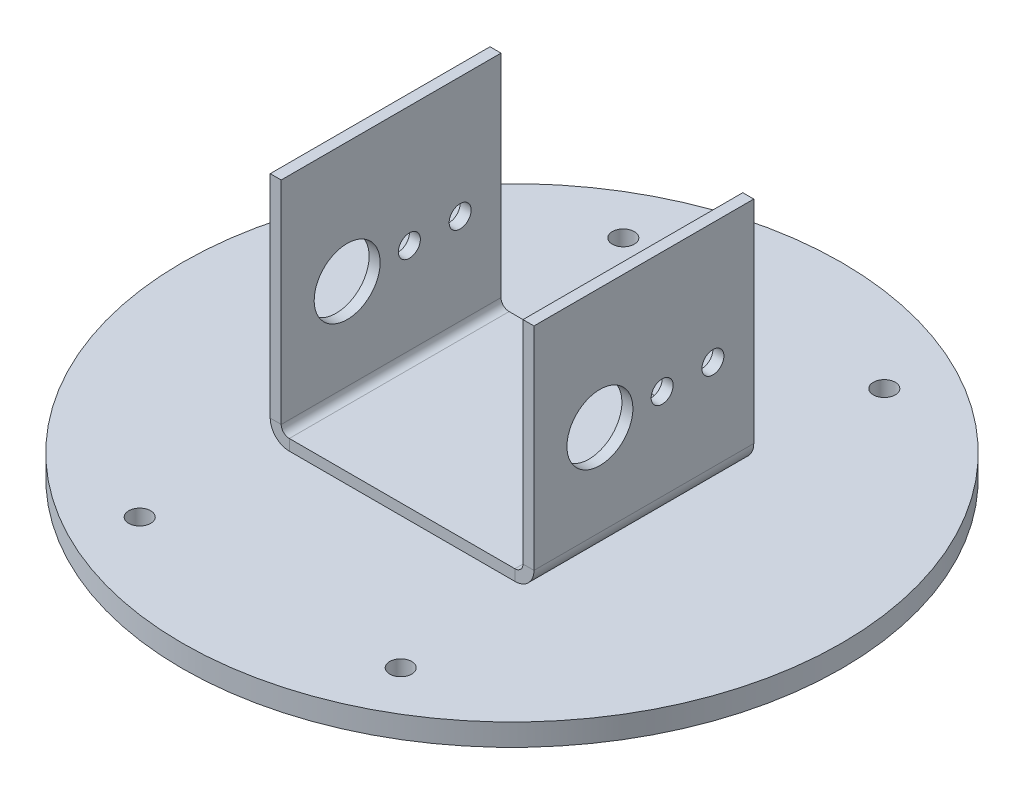
ISO-10303-21;
HEADER;
FILE_DESCRIPTION(('STEP AP214'),'2;1');
FILE_NAME('part.step','',(''),(''),'','','');
FILE_SCHEMA(('AUTOMOTIVE_DESIGN { 1 0 10303 214 1 1 1 1 }'));
ENDSEC;
DATA;
#1=APPLICATION_CONTEXT('core data for automotive mechanical design processes');
#2=APPLICATION_PROTOCOL_DEFINITION('international standard','automotive_design',2000,#1);
#3=PRODUCT_CONTEXT('',#1,'mechanical');
#4=PRODUCT('Part','Part','',(#3));
#5=PRODUCT_RELATED_PRODUCT_CATEGORY('part','',(#4));
#6=PRODUCT_DEFINITION_FORMATION('','',#4);
#7=PRODUCT_DEFINITION_CONTEXT('part definition',#1,'design');
#8=PRODUCT_DEFINITION('design','',#6,#7);
#9=PRODUCT_DEFINITION_SHAPE('','',#8);
#10=(LENGTH_UNIT() NAMED_UNIT(*) SI_UNIT(.MILLI.,.METRE.));
#11=(NAMED_UNIT(*) PLANE_ANGLE_UNIT() SI_UNIT($,.RADIAN.));
#12=(NAMED_UNIT(*) SI_UNIT($,.STERADIAN.) SOLID_ANGLE_UNIT());
#13=UNCERTAINTY_MEASURE_WITH_UNIT(LENGTH_MEASURE(1.E-05),#10,'distance_accuracy_value','');
#14=(GEOMETRIC_REPRESENTATION_CONTEXT(3) GLOBAL_UNCERTAINTY_ASSIGNED_CONTEXT((#13)) GLOBAL_UNIT_ASSIGNED_CONTEXT((#10,
#11,#12)) REPRESENTATION_CONTEXT('',''));
#15=CARTESIAN_POINT('',(0.,0.,0.));
#16=DIRECTION('',(0.,0.,1.));
#17=DIRECTION('',(1.,0.,0.));
#18=AXIS2_PLACEMENT_3D('',#15,#16,#17);
#19=CARTESIAN_POINT('',(-11.,3.,-10.));
#20=DIRECTION('',(0.,0.,1.));
#21=DIRECTION('',(1.,0.,0.));
#22=AXIS2_PLACEMENT_3D('',#19,#20,#21);
#23=PLANE('',#22);
#24=DIRECTION('',(0.,-1.,0.));
#25=VECTOR('',#24,1.);
#26=CARTESIAN_POINT('',(10.2634,3.,-10.));
#27=LINE('',#26,#25);
#28=CARTESIAN_POINT('',(10.2634,3.,-10.));
#29=VERTEX_POINT('',#28);
#30=CARTESIAN_POINT('',(10.2634,2.,-10.));
#31=VERTEX_POINT('',#30);
#32=EDGE_CURVE('E191',#29,#31,#27,.T.);
#33=ORIENTED_EDGE('',*,*,#32,.T.);
#34=DIRECTION('',(-1.,0.,0.));
#35=VECTOR('',#34,1.);
#36=CARTESIAN_POINT('',(-11.,2.,-10.));
#37=LINE('',#36,#35);
#38=CARTESIAN_POINT('',(-10.2634,2.,-10.));
#39=VERTEX_POINT('',#38);
#40=EDGE_CURVE('E251',#31,#39,#37,.T.);
#41=ORIENTED_EDGE('',*,*,#40,.T.);
#42=DIRECTION('',(0.,-1.,0.));
#43=VECTOR('',#42,1.);
#44=CARTESIAN_POINT('',(-10.2634,3.,-10.));
#45=LINE('',#44,#43);
#46=CARTESIAN_POINT('',(-10.2634,3.,-10.));
#47=VERTEX_POINT('',#46);
#48=EDGE_CURVE('E248',#47,#39,#45,.T.);
#49=ORIENTED_EDGE('',*,*,#48,.F.);
#50=DIRECTION('',(-1.,0.,0.));
#51=VECTOR('',#50,1.);
#52=CARTESIAN_POINT('',(-11.,3.,-10.));
#53=LINE('',#52,#51);
#54=EDGE_CURVE('E55',#29,#47,#53,.T.);
#55=ORIENTED_EDGE('',*,*,#54,.F.);
#56=EDGE_LOOP('',(#33,#41,#49,#55));
#57=FACE_BOUND('',#56,.T.);
#58=ADVANCED_FACE('F47',(#57),#23,.F.);
#59=CARTESIAN_POINT('',(-11.,3.,10.));
#60=DIRECTION('',(0.,0.,-1.));
#61=DIRECTION('',(-1.,0.,0.));
#62=AXIS2_PLACEMENT_3D('',#59,#60,#61);
#63=PLANE('',#62);
#64=DIRECTION('',(0.,-1.,0.));
#65=VECTOR('',#64,1.);
#66=CARTESIAN_POINT('',(10.2634,3.,10.));
#67=LINE('',#66,#65);
#68=CARTESIAN_POINT('',(10.2634,3.,10.));
#69=VERTEX_POINT('',#68);
#70=CARTESIAN_POINT('',(10.2634,2.,10.));
#71=VERTEX_POINT('',#70);
#72=EDGE_CURVE('E63',#69,#71,#67,.T.);
#73=ORIENTED_EDGE('',*,*,#72,.F.);
#74=DIRECTION('',(1.,0.,0.));
#75=VECTOR('',#74,1.);
#76=CARTESIAN_POINT('',(-11.,3.,10.));
#77=LINE('',#76,#75);
#78=CARTESIAN_POINT('',(-10.2634,3.,10.));
#79=VERTEX_POINT('',#78);
#80=EDGE_CURVE('E12',#79,#69,#77,.T.);
#81=ORIENTED_EDGE('',*,*,#80,.F.);
#82=DIRECTION('',(0.,-1.,0.));
#83=VECTOR('',#82,1.);
#84=CARTESIAN_POINT('',(-10.2634,3.,10.));
#85=LINE('',#84,#83);
#86=CARTESIAN_POINT('',(-10.2634,2.,10.));
#87=VERTEX_POINT('',#86);
#88=EDGE_CURVE('E237',#79,#87,#85,.T.);
#89=ORIENTED_EDGE('',*,*,#88,.T.);
#90=DIRECTION('',(1.,0.,0.));
#91=VECTOR('',#90,1.);
#92=CARTESIAN_POINT('',(-11.,2.,10.));
#93=LINE('',#92,#91);
#94=EDGE_CURVE('E253',#87,#71,#93,.T.);
#95=ORIENTED_EDGE('',*,*,#94,.T.);
#96=EDGE_LOOP('',(#73,#81,#89,#95));
#97=FACE_BOUND('',#96,.T.);
#98=ADVANCED_FACE('F325',(#97),#63,.F.);
#99=CARTESIAN_POINT('',(0.,3.,0.));
#100=DIRECTION('',(0.,1.,0.));
#101=DIRECTION('',(0.,0.,1.));
#102=AXIS2_PLACEMENT_3D('',#99,#100,#101);
#103=PLANE('',#102);
#104=ORIENTED_EDGE('',*,*,#80,.T.);
#105=DIRECTION('',(0.,0.,-1.));
#106=VECTOR('',#105,1.);
#107=CARTESIAN_POINT('',(10.2634,3.,-10.));
#108=LINE('',#107,#106);
#109=EDGE_CURVE('E69',#29,#69,#108,.F.);
#110=ORIENTED_EDGE('',*,*,#109,.F.);
#111=ORIENTED_EDGE('',*,*,#54,.T.);
#112=DIRECTION('',(0.,0.,1.));
#113=VECTOR('',#112,1.);
#114=CARTESIAN_POINT('',(-10.2634,3.,10.));
#115=LINE('',#114,#113);
#116=EDGE_CURVE('E243',#79,#47,#115,.F.);
#117=ORIENTED_EDGE('',*,*,#116,.F.);
#118=EDGE_LOOP('',(#104,#110,#111,#117));
#119=FACE_BOUND('',#118,.T.);
#120=ADVANCED_FACE('F330',(#119),#103,.T.);
#121=CARTESIAN_POINT('',(0.,2.,0.));
#122=DIRECTION('',(0.,1.,0.));
#123=DIRECTION('',(0.,0.,1.));
#124=AXIS2_PLACEMENT_3D('',#121,#122,#123);
#125=PLANE('',#124);
#126=DIRECTION('',(0.,0.,-1.));
#127=VECTOR('',#126,1.);
#128=CARTESIAN_POINT('',(10.2634,2.,-10.));
#129=LINE('',#128,#127);
#130=EDGE_CURVE('E145',#31,#71,#129,.F.);
#131=ORIENTED_EDGE('',*,*,#130,.T.);
#132=ORIENTED_EDGE('',*,*,#94,.F.);
#133=DIRECTION('',(0.,0.,1.));
#134=VECTOR('',#133,1.);
#135=CARTESIAN_POINT('',(-10.2634,2.,10.));
#136=LINE('',#135,#134);
#137=EDGE_CURVE('E230',#87,#39,#136,.F.);
#138=ORIENTED_EDGE('',*,*,#137,.T.);
#139=ORIENTED_EDGE('',*,*,#40,.F.);
#140=EDGE_LOOP('',(#131,#132,#138,#139));
#141=FACE_BOUND('',#140,.T.);
#142=ADVANCED_FACE('F334',(#141),#125,.F.);
#143=CARTESIAN_POINT('',(-10.2634,3.7366,-10.));
#144=DIRECTION('',(0.,0.,-1.));
#145=DIRECTION('',(-1.,0.,0.));
#146=AXIS2_PLACEMENT_3D('',#143,#144,#145);
#147=PLANE('',#146);
#148=DIRECTION('',(-1.,0.,0.));
#149=VECTOR('',#148,1.);
#150=CARTESIAN_POINT('',(-11.,3.7366,-10.));
#151=LINE('',#150,#149);
#152=CARTESIAN_POINT('',(-11.,3.7366,-10.));
#153=VERTEX_POINT('',#152);
#154=CARTESIAN_POINT('',(-12.,3.73659999999999,-10.));
#155=VERTEX_POINT('',#154);
#156=EDGE_CURVE('E198',#153,#155,#151,.T.);
#157=ORIENTED_EDGE('',*,*,#156,.F.);
#158=CARTESIAN_POINT('',(-10.2634,3.7366,-10.));
#159=DIRECTION('',(0.,0.,1.));
#160=DIRECTION('',(1.,0.,0.));
#161=AXIS2_PLACEMENT_3D('',#158,#159,#160);
#162=CIRCLE('',#161,0.7366);
#163=EDGE_CURVE('E240',#47,#153,#162,.F.);
#164=ORIENTED_EDGE('',*,*,#163,.F.);
#165=ORIENTED_EDGE('',*,*,#48,.T.);
#166=CARTESIAN_POINT('',(-10.2634,3.7366,-10.));
#167=DIRECTION('',(0.,0.,1.));
#168=DIRECTION('',(1.,0.,0.));
#169=AXIS2_PLACEMENT_3D('',#166,#167,#168);
#170=CIRCLE('',#169,1.7366);
#171=EDGE_CURVE('E233',#39,#155,#170,.F.);
#172=ORIENTED_EDGE('',*,*,#171,.T.);
#173=EDGE_LOOP('',(#157,#164,#165,#172));
#174=FACE_BOUND('',#173,.T.);
#175=ADVANCED_FACE('F341',(#174),#147,.T.);
#176=CARTESIAN_POINT('',(-10.2634,3.7366,10.));
#177=DIRECTION('',(0.,0.,-1.));
#178=DIRECTION('',(-1.,0.,0.));
#179=AXIS2_PLACEMENT_3D('',#176,#177,#178);
#180=PLANE('',#179);
#181=CARTESIAN_POINT('',(-10.2634,3.7366,10.));
#182=DIRECTION('',(0.,0.,1.));
#183=DIRECTION('',(1.,0.,0.));
#184=AXIS2_PLACEMENT_3D('',#181,#182,#183);
#185=CIRCLE('',#184,0.7366);
#186=CARTESIAN_POINT('',(-11.,3.7366,10.));
#187=VERTEX_POINT('',#186);
#188=EDGE_CURVE('E229',#187,#79,#185,.T.);
#189=ORIENTED_EDGE('',*,*,#188,.F.);
#190=DIRECTION('',(-1.,0.,0.));
#191=VECTOR('',#190,1.);
#192=CARTESIAN_POINT('',(-11.,3.7366,10.));
#193=LINE('',#192,#191);
#194=CARTESIAN_POINT('',(-12.,3.73659999999999,10.));
#195=VERTEX_POINT('',#194);
#196=EDGE_CURVE('E202',#187,#195,#193,.T.);
#197=ORIENTED_EDGE('',*,*,#196,.T.);
#198=CARTESIAN_POINT('',(-10.2634,3.7366,10.));
#199=DIRECTION('',(0.,0.,1.));
#200=DIRECTION('',(1.,0.,0.));
#201=AXIS2_PLACEMENT_3D('',#198,#199,#200);
#202=CIRCLE('',#201,1.7366);
#203=EDGE_CURVE('E234',#195,#87,#202,.T.);
#204=ORIENTED_EDGE('',*,*,#203,.T.);
#205=ORIENTED_EDGE('',*,*,#88,.F.);
#206=EDGE_LOOP('',(#189,#197,#204,#205));
#207=FACE_BOUND('',#206,.T.);
#208=ADVANCED_FACE('F387',(#207),#180,.F.);
#209=CARTESIAN_POINT('',(-10.2634,3.7366,10.));
#210=DIRECTION('',(0.,0.,1.));
#211=DIRECTION('',(-1.,0.,0.));
#212=AXIS2_PLACEMENT_3D('',#209,#210,#211);
#213=CYLINDRICAL_SURFACE('',#212,1.7366);
#214=ORIENTED_EDGE('',*,*,#137,.F.);
#215=ORIENTED_EDGE('',*,*,#203,.F.);
#216=DIRECTION('',(0.,0.,-1.));
#217=VECTOR('',#216,1.);
#218=CARTESIAN_POINT('',(-12.,3.73659999999999,0.));
#219=LINE('',#218,#217);
#220=EDGE_CURVE('E205',#195,#155,#219,.T.);
#221=ORIENTED_EDGE('',*,*,#220,.T.);
#222=ORIENTED_EDGE('',*,*,#171,.F.);
#223=EDGE_LOOP('',(#214,#215,#221,#222));
#224=FACE_BOUND('',#223,.T.);
#225=ADVANCED_FACE('F342',(#224),#213,.T.);
#226=CARTESIAN_POINT('',(-10.2634,3.7366,10.));
#227=DIRECTION('',(0.,0.,1.));
#228=DIRECTION('',(-1.,0.,0.));
#229=AXIS2_PLACEMENT_3D('',#226,#227,#228);
#230=CYLINDRICAL_SURFACE('',#229,0.7366);
#231=ORIENTED_EDGE('',*,*,#116,.T.);
#232=ORIENTED_EDGE('',*,*,#163,.T.);
#233=DIRECTION('',(0.,0.,1.));
#234=VECTOR('',#233,1.);
#235=CARTESIAN_POINT('',(-11.,3.7366,-10.));
#236=LINE('',#235,#234);
#237=EDGE_CURVE('E200',#153,#187,#236,.T.);
#238=ORIENTED_EDGE('',*,*,#237,.T.);
#239=ORIENTED_EDGE('',*,*,#188,.T.);
#240=EDGE_LOOP('',(#231,#232,#238,#239));
#241=FACE_BOUND('',#240,.T.);
#242=ADVANCED_FACE('F363',(#241),#230,.F.);
#243=CARTESIAN_POINT('',(-12.,3.,-10.));
#244=DIRECTION('',(0.,0.,1.));
#245=DIRECTION('',(1.,0.,0.));
#246=AXIS2_PLACEMENT_3D('',#243,#244,#245);
#247=PLANE('',#246);
#248=ORIENTED_EDGE('',*,*,#156,.T.);
#249=DIRECTION('',(0.,-1.,0.));
#250=VECTOR('',#249,1.);
#251=CARTESIAN_POINT('',(-12.,3.,-10.));
#252=LINE('',#251,#250);
#253=CARTESIAN_POINT('',(-12.0000000000001,23.,-10.));
#254=VERTEX_POINT('',#253);
#255=EDGE_CURVE('E210',#254,#155,#252,.T.);
#256=ORIENTED_EDGE('',*,*,#255,.F.);
#257=DIRECTION('',(1.,0.,0.));
#258=VECTOR('',#257,1.);
#259=CARTESIAN_POINT('',(-12.0000000000001,23.,-10.));
#260=LINE('',#259,#258);
#261=CARTESIAN_POINT('',(-11.0000000000001,23.,-10.));
#262=VERTEX_POINT('',#261);
#263=EDGE_CURVE('E218',#254,#262,#260,.T.);
#264=ORIENTED_EDGE('',*,*,#263,.T.);
#265=DIRECTION('',(0.,-1.,0.));
#266=VECTOR('',#265,1.);
#267=CARTESIAN_POINT('',(-11.,3.,-10.));
#268=LINE('',#267,#266);
#269=EDGE_CURVE('E209',#262,#153,#268,.T.);
#270=ORIENTED_EDGE('',*,*,#269,.T.);
#271=EDGE_LOOP('',(#248,#256,#264,#270));
#272=FACE_BOUND('',#271,.T.);
#273=ADVANCED_FACE('F360',(#272),#247,.F.);
#274=CARTESIAN_POINT('',(-12.0000000000001,23.,10.));
#275=DIRECTION('',(0.,0.,-1.));
#276=DIRECTION('',(-1.,0.,0.));
#277=AXIS2_PLACEMENT_3D('',#274,#275,#276);
#278=PLANE('',#277);
#279=ORIENTED_EDGE('',*,*,#196,.F.);
#280=DIRECTION('',(0.,1.,0.));
#281=VECTOR('',#280,1.);
#282=CARTESIAN_POINT('',(-11.0000000000001,23.,10.));
#283=LINE('',#282,#281);
#284=CARTESIAN_POINT('',(-11.0000000000001,23.,10.));
#285=VERTEX_POINT('',#284);
#286=EDGE_CURVE('E221',#187,#285,#283,.T.);
#287=ORIENTED_EDGE('',*,*,#286,.T.);
#288=DIRECTION('',(1.,0.,0.));
#289=VECTOR('',#288,1.);
#290=CARTESIAN_POINT('',(-12.0000000000001,23.,10.));
#291=LINE('',#290,#289);
#292=CARTESIAN_POINT('',(-12.0000000000001,23.,10.));
#293=VERTEX_POINT('',#292);
#294=EDGE_CURVE('E226',#293,#285,#291,.T.);
#295=ORIENTED_EDGE('',*,*,#294,.F.);
#296=DIRECTION('',(0.,1.,0.));
#297=VECTOR('',#296,1.);
#298=CARTESIAN_POINT('',(-12.0000000000001,23.,10.));
#299=LINE('',#298,#297);
#300=EDGE_CURVE('E213',#195,#293,#299,.T.);
#301=ORIENTED_EDGE('',*,*,#300,.F.);
#302=EDGE_LOOP('',(#279,#287,#295,#301));
#303=FACE_BOUND('',#302,.T.);
#304=ADVANCED_FACE('F351',(#303),#278,.F.);
#305=CARTESIAN_POINT('',(-12.,0.,0.));
#306=DIRECTION('',(1.,0.,0.));
#307=DIRECTION('',(0.,1.,0.));
#308=AXIS2_PLACEMENT_3D('',#305,#306,#307);
#309=PLANE('',#308);
#310=CARTESIAN_POINT('',(-12.,12.,4.));
#311=DIRECTION('',(1.,0.,0.));
#312=DIRECTION('',(0.,1.,0.));
#313=AXIS2_PLACEMENT_3D('',#310,#311,#312);
#314=CIRCLE('',#313,3.);
#315=CARTESIAN_POINT('',(-12.,15.,4.));
#316=VERTEX_POINT('',#315);
#317=EDGE_CURVE('E289',#316,#316,#314,.T.);
#318=ORIENTED_EDGE('',*,*,#317,.T.);
#319=EDGE_LOOP('',(#318));
#320=FACE_BOUND('',#319,.T.);
#321=CARTESIAN_POINT('',(-12.,12.,-1.66216744596718));
#322=DIRECTION('',(1.,0.,0.));
#323=DIRECTION('',(0.,1.,0.));
#324=AXIS2_PLACEMENT_3D('',#321,#322,#323);
#325=CIRCLE('',#324,1.);
#326=CARTESIAN_POINT('',(-12.,13.,-1.66216744596718));
#327=VERTEX_POINT('',#326);
#328=EDGE_CURVE('E280',#327,#327,#325,.T.);
#329=ORIENTED_EDGE('',*,*,#328,.T.);
#330=EDGE_LOOP('',(#329));
#331=FACE_BOUND('',#330,.T.);
#332=CARTESIAN_POINT('',(-12.,12.,-6.28061731806504));
#333=DIRECTION('',(1.,0.,0.));
#334=DIRECTION('',(0.,1.,0.));
#335=AXIS2_PLACEMENT_3D('',#332,#333,#334);
#336=CIRCLE('',#335,1.);
#337=CARTESIAN_POINT('',(-12.,13.,-6.28061731806504));
#338=VERTEX_POINT('',#337);
#339=EDGE_CURVE('E263',#338,#338,#336,.T.);
#340=ORIENTED_EDGE('',*,*,#339,.T.);
#341=EDGE_LOOP('',(#340));
#342=FACE_BOUND('',#341,.T.);
#343=ORIENTED_EDGE('',*,*,#220,.F.);
#344=ORIENTED_EDGE('',*,*,#300,.T.);
#345=DIRECTION('',(0.,0.,-1.));
#346=VECTOR('',#345,1.);
#347=CARTESIAN_POINT('',(-12.0000000000001,23.,-10.));
#348=LINE('',#347,#346);
#349=EDGE_CURVE('E216',#293,#254,#348,.T.);
#350=ORIENTED_EDGE('',*,*,#349,.T.);
#351=ORIENTED_EDGE('',*,*,#255,.T.);
#352=EDGE_LOOP('',(#343,#344,#350,#351));
#353=FACE_BOUND('',#352,.T.);
#354=ADVANCED_FACE('F346',(#320,#331,#342,#353),#309,.F.);
#355=CARTESIAN_POINT('',(-11.,0.,0.));
#356=DIRECTION('',(1.,0.,0.));
#357=DIRECTION('',(0.,1.,0.));
#358=AXIS2_PLACEMENT_3D('',#355,#356,#357);
#359=PLANE('',#358);
#360=CARTESIAN_POINT('',(-11.,12.,4.));
#361=DIRECTION('',(1.,0.,0.));
#362=DIRECTION('',(0.,1.,0.));
#363=AXIS2_PLACEMENT_3D('',#360,#361,#362);
#364=CIRCLE('',#363,3.);
#365=CARTESIAN_POINT('',(-11.,15.,4.));
#366=VERTEX_POINT('',#365);
#367=EDGE_CURVE('E286',#366,#366,#364,.T.);
#368=ORIENTED_EDGE('',*,*,#367,.F.);
#369=EDGE_LOOP('',(#368));
#370=FACE_BOUND('',#369,.T.);
#371=CARTESIAN_POINT('',(-11.,12.,-1.66216744596718));
#372=DIRECTION('',(1.,0.,0.));
#373=DIRECTION('',(0.,1.,0.));
#374=AXIS2_PLACEMENT_3D('',#371,#372,#373);
#375=CIRCLE('',#374,1.);
#376=CARTESIAN_POINT('',(-11.,13.,-1.66216744596718));
#377=VERTEX_POINT('',#376);
#378=EDGE_CURVE('E267',#377,#377,#375,.T.);
#379=ORIENTED_EDGE('',*,*,#378,.F.);
#380=EDGE_LOOP('',(#379));
#381=FACE_BOUND('',#380,.T.);
#382=CARTESIAN_POINT('',(-11.,12.,-6.28061731806504));
#383=DIRECTION('',(1.,0.,0.));
#384=DIRECTION('',(0.,1.,0.));
#385=AXIS2_PLACEMENT_3D('',#382,#383,#384);
#386=CIRCLE('',#385,1.);
#387=CARTESIAN_POINT('',(-11.,13.,-6.28061731806504));
#388=VERTEX_POINT('',#387);
#389=EDGE_CURVE('E270',#388,#388,#386,.T.);
#390=ORIENTED_EDGE('',*,*,#389,.F.);
#391=EDGE_LOOP('',(#390));
#392=FACE_BOUND('',#391,.T.);
#393=ORIENTED_EDGE('',*,*,#286,.F.);
#394=ORIENTED_EDGE('',*,*,#237,.F.);
#395=ORIENTED_EDGE('',*,*,#269,.F.);
#396=DIRECTION('',(0.,0.,-1.));
#397=VECTOR('',#396,1.);
#398=CARTESIAN_POINT('',(-11.0000000000001,23.,-10.));
#399=LINE('',#398,#397);
#400=EDGE_CURVE('E214',#285,#262,#399,.T.);
#401=ORIENTED_EDGE('',*,*,#400,.F.);
#402=EDGE_LOOP('',(#393,#394,#395,#401));
#403=FACE_BOUND('',#402,.T.);
#404=ADVANCED_FACE('F366',(#370,#381,#392,#403),#359,.T.);
#405=CARTESIAN_POINT('',(-12.0000000000001,23.,-10.));
#406=DIRECTION('',(0.,-1.,0.));
#407=DIRECTION('',(1.,0.,0.));
#408=AXIS2_PLACEMENT_3D('',#405,#406,#407);
#409=PLANE('',#408);
#410=ORIENTED_EDGE('',*,*,#400,.T.);
#411=ORIENTED_EDGE('',*,*,#263,.F.);
#412=ORIENTED_EDGE('',*,*,#349,.F.);
#413=ORIENTED_EDGE('',*,*,#294,.T.);
#414=EDGE_LOOP('',(#410,#411,#412,#413));
#415=FACE_BOUND('',#414,.T.);
#416=ADVANCED_FACE('F357',(#415),#409,.F.);
#417=CARTESIAN_POINT('',(10.2634,3.7366,10.));
#418=DIRECTION('',(0.,0.,1.));
#419=DIRECTION('',(1.,0.,0.));
#420=AXIS2_PLACEMENT_3D('',#417,#418,#419);
#421=PLANE('',#420);
#422=DIRECTION('',(1.,0.,0.));
#423=VECTOR('',#422,1.);
#424=CARTESIAN_POINT('',(11.,3.7366,10.));
#425=LINE('',#424,#423);
#426=CARTESIAN_POINT('',(11.,3.7366,10.));
#427=VERTEX_POINT('',#426);
#428=CARTESIAN_POINT('',(12.,3.73659999999999,10.));
#429=VERTEX_POINT('',#428);
#430=EDGE_CURVE('E292',#427,#429,#425,.T.);
#431=ORIENTED_EDGE('',*,*,#430,.F.);
#432=CARTESIAN_POINT('',(10.2634,3.7366,10.));
#433=DIRECTION('',(0.,0.,-1.));
#434=DIRECTION('',(-1.,0.,0.));
#435=AXIS2_PLACEMENT_3D('',#432,#433,#434);
#436=CIRCLE('',#435,0.7366);
#437=EDGE_CURVE('E148',#69,#427,#436,.F.);
#438=ORIENTED_EDGE('',*,*,#437,.F.);
#439=ORIENTED_EDGE('',*,*,#72,.T.);
#440=CARTESIAN_POINT('',(10.2634,3.7366,10.));
#441=DIRECTION('',(0.,0.,-1.));
#442=DIRECTION('',(-1.,0.,0.));
#443=AXIS2_PLACEMENT_3D('',#440,#441,#442);
#444=CIRCLE('',#443,1.7366);
#445=EDGE_CURVE('E190',#71,#429,#444,.F.);
#446=ORIENTED_EDGE('',*,*,#445,.T.);
#447=EDGE_LOOP('',(#431,#438,#439,#446));
#448=FACE_BOUND('',#447,.T.);
#449=ADVANCED_FACE('F300',(#448),#421,.T.);
#450=CARTESIAN_POINT('',(10.2634,3.7366,-10.));
#451=DIRECTION('',(0.,0.,1.));
#452=DIRECTION('',(1.,0.,0.));
#453=AXIS2_PLACEMENT_3D('',#450,#451,#452);
#454=PLANE('',#453);
#455=CARTESIAN_POINT('',(10.2634,3.7366,-10.));
#456=DIRECTION('',(0.,0.,-1.));
#457=DIRECTION('',(-1.,0.,0.));
#458=AXIS2_PLACEMENT_3D('',#455,#456,#457);
#459=CIRCLE('',#458,0.7366);
#460=CARTESIAN_POINT('',(11.,3.7366,-10.));
#461=VERTEX_POINT('',#460);
#462=EDGE_CURVE('E155',#461,#29,#459,.T.);
#463=ORIENTED_EDGE('',*,*,#462,.F.);
#464=DIRECTION('',(1.,0.,0.));
#465=VECTOR('',#464,1.);
#466=CARTESIAN_POINT('',(11.,3.7366,-10.));
#467=LINE('',#466,#465);
#468=CARTESIAN_POINT('',(12.,3.73659999999999,-10.));
#469=VERTEX_POINT('',#468);
#470=EDGE_CURVE('E152',#461,#469,#467,.T.);
#471=ORIENTED_EDGE('',*,*,#470,.T.);
#472=CARTESIAN_POINT('',(10.2634,3.7366,-10.));
#473=DIRECTION('',(0.,0.,-1.));
#474=DIRECTION('',(-1.,0.,0.));
#475=AXIS2_PLACEMENT_3D('',#472,#473,#474);
#476=CIRCLE('',#475,1.7366);
#477=EDGE_CURVE('E138',#469,#31,#476,.T.);
#478=ORIENTED_EDGE('',*,*,#477,.T.);
#479=ORIENTED_EDGE('',*,*,#32,.F.);
#480=EDGE_LOOP('',(#463,#471,#478,#479));
#481=FACE_BOUND('',#480,.T.);
#482=ADVANCED_FACE('F153',(#481),#454,.F.);
#483=CARTESIAN_POINT('',(10.2634,3.7366,-10.));
#484=DIRECTION('',(0.,0.,-1.));
#485=DIRECTION('',(1.,0.,0.));
#486=AXIS2_PLACEMENT_3D('',#483,#484,#485);
#487=CYLINDRICAL_SURFACE('',#486,1.7366);
#488=ORIENTED_EDGE('',*,*,#130,.F.);
#489=ORIENTED_EDGE('',*,*,#477,.F.);
#490=DIRECTION('',(0.,0.,1.));
#491=VECTOR('',#490,1.);
#492=CARTESIAN_POINT('',(12.,3.73659999999999,0.));
#493=LINE('',#492,#491);
#494=EDGE_CURVE('E143',#469,#429,#493,.T.);
#495=ORIENTED_EDGE('',*,*,#494,.T.);
#496=ORIENTED_EDGE('',*,*,#445,.F.);
#497=EDGE_LOOP('',(#488,#489,#495,#496));
#498=FACE_BOUND('',#497,.T.);
#499=ADVANCED_FACE('F140',(#498),#487,.T.);
#500=CARTESIAN_POINT('',(10.2634,3.7366,-10.));
#501=DIRECTION('',(0.,0.,-1.));
#502=DIRECTION('',(1.,0.,0.));
#503=AXIS2_PLACEMENT_3D('',#500,#501,#502);
#504=CYLINDRICAL_SURFACE('',#503,0.7366);
#505=ORIENTED_EDGE('',*,*,#109,.T.);
#506=ORIENTED_EDGE('',*,*,#437,.T.);
#507=DIRECTION('',(0.,0.,-1.));
#508=VECTOR('',#507,1.);
#509=CARTESIAN_POINT('',(11.,3.7366,10.));
#510=LINE('',#509,#508);
#511=EDGE_CURVE('E159',#427,#461,#510,.T.);
#512=ORIENTED_EDGE('',*,*,#511,.T.);
#513=ORIENTED_EDGE('',*,*,#462,.T.);
#514=EDGE_LOOP('',(#505,#506,#512,#513));
#515=FACE_BOUND('',#514,.T.);
#516=ADVANCED_FACE('F303',(#515),#504,.F.);
#517=CARTESIAN_POINT('',(12.,3.,10.));
#518=DIRECTION('',(0.,0.,-1.));
#519=DIRECTION('',(-1.,0.,0.));
#520=AXIS2_PLACEMENT_3D('',#517,#518,#519);
#521=PLANE('',#520);
#522=ORIENTED_EDGE('',*,*,#430,.T.);
#523=DIRECTION('',(0.,-1.,0.));
#524=VECTOR('',#523,1.);
#525=CARTESIAN_POINT('',(12.,3.,10.));
#526=LINE('',#525,#524);
#527=CARTESIAN_POINT('',(12.0000000000001,23.,10.));
#528=VERTEX_POINT('',#527);
#529=EDGE_CURVE('E167',#528,#429,#526,.T.);
#530=ORIENTED_EDGE('',*,*,#529,.F.);
#531=DIRECTION('',(-1.,0.,0.));
#532=VECTOR('',#531,1.);
#533=CARTESIAN_POINT('',(12.0000000000001,23.,10.));
#534=LINE('',#533,#532);
#535=CARTESIAN_POINT('',(11.0000000000001,23.,10.));
#536=VERTEX_POINT('',#535);
#537=EDGE_CURVE('E176',#528,#536,#534,.T.);
#538=ORIENTED_EDGE('',*,*,#537,.T.);
#539=DIRECTION('',(0.,-1.,0.));
#540=VECTOR('',#539,1.);
#541=CARTESIAN_POINT('',(11.,3.,10.));
#542=LINE('',#541,#540);
#543=EDGE_CURVE('E168',#536,#427,#542,.T.);
#544=ORIENTED_EDGE('',*,*,#543,.T.);
#545=EDGE_LOOP('',(#522,#530,#538,#544));
#546=FACE_BOUND('',#545,.T.);
#547=ADVANCED_FACE('F296',(#546),#521,.F.);
#548=CARTESIAN_POINT('',(12.0000000000001,23.,-10.));
#549=DIRECTION('',(0.,0.,1.));
#550=DIRECTION('',(0.,-1.,0.));
#551=AXIS2_PLACEMENT_3D('',#548,#549,#550);
#552=PLANE('',#551);
#553=ORIENTED_EDGE('',*,*,#470,.F.);
#554=DIRECTION('',(0.,1.,0.));
#555=VECTOR('',#554,1.);
#556=CARTESIAN_POINT('',(11.0000000000001,23.,-10.));
#557=LINE('',#556,#555);
#558=CARTESIAN_POINT('',(11.0000000000001,23.,-10.));
#559=VERTEX_POINT('',#558);
#560=EDGE_CURVE('E183',#461,#559,#557,.T.);
#561=ORIENTED_EDGE('',*,*,#560,.T.);
#562=DIRECTION('',(-1.,0.,0.));
#563=VECTOR('',#562,1.);
#564=CARTESIAN_POINT('',(12.0000000000001,23.,-10.));
#565=LINE('',#564,#563);
#566=CARTESIAN_POINT('',(12.0000000000001,23.,-10.));
#567=VERTEX_POINT('',#566);
#568=EDGE_CURVE('E172',#567,#559,#565,.T.);
#569=ORIENTED_EDGE('',*,*,#568,.F.);
#570=DIRECTION('',(0.,1.,0.));
#571=VECTOR('',#570,1.);
#572=CARTESIAN_POINT('',(12.0000000000001,23.,-10.));
#573=LINE('',#572,#571);
#574=EDGE_CURVE('E164',#469,#567,#573,.T.);
#575=ORIENTED_EDGE('',*,*,#574,.F.);
#576=EDGE_LOOP('',(#553,#561,#569,#575));
#577=FACE_BOUND('',#576,.T.);
#578=ADVANCED_FACE('F170',(#577),#552,.F.);
#579=CARTESIAN_POINT('',(12.,0.,0.));
#580=DIRECTION('',(-1.,0.,0.));
#581=DIRECTION('',(0.,-1.,0.));
#582=AXIS2_PLACEMENT_3D('',#579,#580,#581);
#583=PLANE('',#582);
#584=CARTESIAN_POINT('',(12.,12.,4.));
#585=DIRECTION('',(-1.,0.,0.));
#586=DIRECTION('',(0.,-1.,0.));
#587=AXIS2_PLACEMENT_3D('',#584,#585,#586);
#588=CIRCLE('',#587,3.);
#589=CARTESIAN_POINT('',(12.,9.,4.));
#590=VERTEX_POINT('',#589);
#591=EDGE_CURVE('E283',#590,#590,#588,.T.);
#592=ORIENTED_EDGE('',*,*,#591,.T.);
#593=EDGE_LOOP('',(#592));
#594=FACE_BOUND('',#593,.T.);
#595=CARTESIAN_POINT('',(12.,12.,-1.66216744596718));
#596=DIRECTION('',(-1.,0.,0.));
#597=DIRECTION('',(0.,-1.,0.));
#598=AXIS2_PLACEMENT_3D('',#595,#596,#597);
#599=CIRCLE('',#598,1.);
#600=CARTESIAN_POINT('',(12.,11.,-1.66216744596718));
#601=VERTEX_POINT('',#600);
#602=EDGE_CURVE('E262',#601,#601,#599,.T.);
#603=ORIENTED_EDGE('',*,*,#602,.T.);
#604=EDGE_LOOP('',(#603));
#605=FACE_BOUND('',#604,.T.);
#606=CARTESIAN_POINT('',(12.,12.,-6.28061731806504));
#607=DIRECTION('',(-1.,0.,0.));
#608=DIRECTION('',(0.,-1.,0.));
#609=AXIS2_PLACEMENT_3D('',#606,#607,#608);
#610=CIRCLE('',#609,1.);
#611=CARTESIAN_POINT('',(12.,11.,-6.28061731806504));
#612=VERTEX_POINT('',#611);
#613=EDGE_CURVE('E259',#612,#612,#610,.T.);
#614=ORIENTED_EDGE('',*,*,#613,.T.);
#615=EDGE_LOOP('',(#614));
#616=FACE_BOUND('',#615,.T.);
#617=ORIENTED_EDGE('',*,*,#494,.F.);
#618=ORIENTED_EDGE('',*,*,#574,.T.);
#619=DIRECTION('',(0.,0.,1.));
#620=VECTOR('',#619,1.);
#621=CARTESIAN_POINT('',(12.0000000000001,23.,10.));
#622=LINE('',#621,#620);
#623=EDGE_CURVE('E174',#567,#528,#622,.T.);
#624=ORIENTED_EDGE('',*,*,#623,.T.);
#625=ORIENTED_EDGE('',*,*,#529,.T.);
#626=EDGE_LOOP('',(#617,#618,#624,#625));
#627=FACE_BOUND('',#626,.T.);
#628=ADVANCED_FACE('F163',(#594,#605,#616,#627),#583,.F.);
#629=CARTESIAN_POINT('',(11.,0.,0.));
#630=DIRECTION('',(-1.,0.,0.));
#631=DIRECTION('',(0.,-1.,0.));
#632=AXIS2_PLACEMENT_3D('',#629,#630,#631);
#633=PLANE('',#632);
#634=CARTESIAN_POINT('',(11.,12.,4.));
#635=DIRECTION('',(-1.,0.,0.));
#636=DIRECTION('',(0.,-1.,0.));
#637=AXIS2_PLACEMENT_3D('',#634,#635,#636);
#638=CIRCLE('',#637,3.);
#639=CARTESIAN_POINT('',(11.,9.,4.));
#640=VERTEX_POINT('',#639);
#641=EDGE_CURVE('E50',#640,#640,#638,.T.);
#642=ORIENTED_EDGE('',*,*,#641,.F.);
#643=EDGE_LOOP('',(#642));
#644=FACE_BOUND('',#643,.T.);
#645=CARTESIAN_POINT('',(11.,12.,-1.66216744596718));
#646=DIRECTION('',(-1.,0.,0.));
#647=DIRECTION('',(0.,-1.,0.));
#648=AXIS2_PLACEMENT_3D('',#645,#646,#647);
#649=CIRCLE('',#648,1.);
#650=CARTESIAN_POINT('',(11.,11.,-1.66216744596718));
#651=VERTEX_POINT('',#650);
#652=EDGE_CURVE('E260',#651,#651,#649,.T.);
#653=ORIENTED_EDGE('',*,*,#652,.F.);
#654=EDGE_LOOP('',(#653));
#655=FACE_BOUND('',#654,.T.);
#656=CARTESIAN_POINT('',(11.,12.,-6.28061731806504));
#657=DIRECTION('',(-1.,0.,0.));
#658=DIRECTION('',(0.,-1.,0.));
#659=AXIS2_PLACEMENT_3D('',#656,#657,#658);
#660=CIRCLE('',#659,1.);
#661=CARTESIAN_POINT('',(11.,11.,-6.28061731806504));
#662=VERTEX_POINT('',#661);
#663=EDGE_CURVE('E257',#662,#662,#660,.T.);
#664=ORIENTED_EDGE('',*,*,#663,.F.);
#665=EDGE_LOOP('',(#664));
#666=FACE_BOUND('',#665,.T.);
#667=ORIENTED_EDGE('',*,*,#560,.F.);
#668=ORIENTED_EDGE('',*,*,#511,.F.);
#669=ORIENTED_EDGE('',*,*,#543,.F.);
#670=DIRECTION('',(0.,0.,1.));
#671=VECTOR('',#670,1.);
#672=CARTESIAN_POINT('',(11.0000000000001,23.,10.));
#673=LINE('',#672,#671);
#674=EDGE_CURVE('E178',#559,#536,#673,.T.);
#675=ORIENTED_EDGE('',*,*,#674,.F.);
#676=EDGE_LOOP('',(#667,#668,#669,#675));
#677=FACE_BOUND('',#676,.T.);
#678=ADVANCED_FACE('F305',(#644,#655,#666,#677),#633,.T.);
#679=CARTESIAN_POINT('',(12.0000000000001,23.,10.));
#680=DIRECTION('',(0.,-1.,0.));
#681=DIRECTION('',(1.,0.,0.));
#682=AXIS2_PLACEMENT_3D('',#679,#680,#681);
#683=PLANE('',#682);
#684=ORIENTED_EDGE('',*,*,#674,.T.);
#685=ORIENTED_EDGE('',*,*,#537,.F.);
#686=ORIENTED_EDGE('',*,*,#623,.F.);
#687=ORIENTED_EDGE('',*,*,#568,.T.);
#688=EDGE_LOOP('',(#684,#685,#686,#687));
#689=FACE_BOUND('',#688,.T.);
#690=ADVANCED_FACE('F308',(#689),#683,.F.);
#691=CARTESIAN_POINT('',(-30.,12.,-6.28061731806504));
#692=DIRECTION('',(1.,0.,0.));
#693=DIRECTION('',(0.,0.,-1.));
#694=AXIS2_PLACEMENT_3D('',#691,#692,#693);
#695=CYLINDRICAL_SURFACE('',#694,1.);
#696=ORIENTED_EDGE('',*,*,#663,.T.);
#697=EDGE_LOOP('',(#696));
#698=FACE_BOUND('',#697,.T.);
#699=ORIENTED_EDGE('',*,*,#613,.F.);
#700=EDGE_LOOP('',(#699));
#701=FACE_BOUND('',#700,.T.);
#702=ADVANCED_FACE('F311',(#698,#701),#695,.F.);
#703=CARTESIAN_POINT('',(-30.,12.,-1.66216744596718));
#704=DIRECTION('',(1.,0.,0.));
#705=DIRECTION('',(0.,0.,-1.));
#706=AXIS2_PLACEMENT_3D('',#703,#704,#705);
#707=CYLINDRICAL_SURFACE('',#706,1.);
#708=ORIENTED_EDGE('',*,*,#652,.T.);
#709=EDGE_LOOP('',(#708));
#710=FACE_BOUND('',#709,.T.);
#711=ORIENTED_EDGE('',*,*,#602,.F.);
#712=EDGE_LOOP('',(#711));
#713=FACE_BOUND('',#712,.T.);
#714=ADVANCED_FACE('F317',(#710,#713),#707,.F.);
#715=CARTESIAN_POINT('',(-30.,12.,4.));
#716=DIRECTION('',(1.,0.,0.));
#717=DIRECTION('',(0.,0.,-1.));
#718=AXIS2_PLACEMENT_3D('',#715,#716,#717);
#719=CYLINDRICAL_SURFACE('',#718,3.);
#720=ORIENTED_EDGE('',*,*,#641,.T.);
#721=EDGE_LOOP('',(#720));
#722=FACE_BOUND('',#721,.T.);
#723=ORIENTED_EDGE('',*,*,#591,.F.);
#724=EDGE_LOOP('',(#723));
#725=FACE_BOUND('',#724,.T.);
#726=ADVANCED_FACE('F475',(#722,#725),#719,.F.);
#727=ORIENTED_EDGE('',*,*,#389,.T.);
#728=EDGE_LOOP('',(#727));
#729=FACE_BOUND('',#728,.T.);
#730=ORIENTED_EDGE('',*,*,#339,.F.);
#731=EDGE_LOOP('',(#730));
#732=FACE_BOUND('',#731,.T.);
#733=ADVANCED_FACE('F320',(#729,#732),#695,.F.);
#734=ORIENTED_EDGE('',*,*,#378,.T.);
#735=EDGE_LOOP('',(#734));
#736=FACE_BOUND('',#735,.T.);
#737=ORIENTED_EDGE('',*,*,#328,.F.);
#738=EDGE_LOOP('',(#737));
#739=FACE_BOUND('',#738,.T.);
#740=ADVANCED_FACE('F477',(#736,#739),#707,.F.);
#741=ORIENTED_EDGE('',*,*,#367,.T.);
#742=EDGE_LOOP('',(#741));
#743=FACE_BOUND('',#742,.T.);
#744=ORIENTED_EDGE('',*,*,#317,.F.);
#745=EDGE_LOOP('',(#744));
#746=FACE_BOUND('',#745,.T.);
#747=ADVANCED_FACE('F487',(#743,#746),#719,.F.);
#748=CLOSED_SHELL('',(#58,#98,#120,#142,#175,#208,#225,#242,#273,#304,#354,#404,#416,#449,#482,
#499,#516,#547,#578,#628,#678,#690,#702,#714,#726,#733,#740,#747));
#749=MANIFOLD_SOLID_BREP('B2',#748);
#750=CARTESIAN_POINT('',(0.,2.,0.));
#751=DIRECTION('',(0.,1.,0.));
#752=DIRECTION('',(0.,0.,1.));
#753=AXIS2_PLACEMENT_3D('',#750,#751,#752);
#754=PLANE('',#753);
#755=CARTESIAN_POINT('',(11.8743420870379,2.,22.));
#756=DIRECTION('',(0.,1.,0.));
#757=DIRECTION('',(0.,0.,1.));
#758=AXIS2_PLACEMENT_3D('',#755,#756,#757);
#759=CIRCLE('',#758,1.);
#760=CARTESIAN_POINT('',(11.8743420870379,2.,23.));
#761=VERTEX_POINT('',#760);
#762=EDGE_CURVE('E680',#761,#761,#759,.T.);
#763=ORIENTED_EDGE('',*,*,#762,.F.);
#764=EDGE_LOOP('',(#763));
#765=FACE_BOUND('',#764,.T.);
#766=CARTESIAN_POINT('',(-11.8743420870379,2.,-22.));
#767=DIRECTION('',(0.,1.,0.));
#768=DIRECTION('',(0.,0.,1.));
#769=AXIS2_PLACEMENT_3D('',#766,#767,#768);
#770=CIRCLE('',#769,1.);
#771=CARTESIAN_POINT('',(-11.8743420870379,2.,-21.));
#772=VERTEX_POINT('',#771);
#773=EDGE_CURVE('E669',#772,#772,#770,.T.);
#774=ORIENTED_EDGE('',*,*,#773,.F.);
#775=EDGE_LOOP('',(#774));
#776=FACE_BOUND('',#775,.T.);
#777=CARTESIAN_POINT('',(0.,2.,0.));
#778=DIRECTION('',(0.,1.,0.));
#779=DIRECTION('',(0.,0.,1.));
#780=AXIS2_PLACEMENT_3D('',#777,#778,#779);
#781=CIRCLE('',#780,30.);
#782=CARTESIAN_POINT('',(0.,2.,30.));
#783=VERTEX_POINT('',#782);
#784=EDGE_CURVE('E46',#783,#783,#781,.T.);
#785=ORIENTED_EDGE('',*,*,#784,.T.);
#786=EDGE_LOOP('',(#785));
#787=FACE_BOUND('',#786,.T.);
#788=CARTESIAN_POINT('',(11.8743420870379,2.,-22.));
#789=DIRECTION('',(0.,1.,0.));
#790=DIRECTION('',(0.,0.,1.));
#791=AXIS2_PLACEMENT_3D('',#788,#789,#790);
#792=CIRCLE('',#791,1.);
#793=CARTESIAN_POINT('',(11.8743420870379,2.,-21.));
#794=VERTEX_POINT('',#793);
#795=EDGE_CURVE('E674',#794,#794,#792,.T.);
#796=ORIENTED_EDGE('',*,*,#795,.F.);
#797=EDGE_LOOP('',(#796));
#798=FACE_BOUND('',#797,.T.);
#799=CARTESIAN_POINT('',(-11.8743420870379,2.,22.));
#800=DIRECTION('',(0.,1.,0.));
#801=DIRECTION('',(0.,0.,1.));
#802=AXIS2_PLACEMENT_3D('',#799,#800,#801);
#803=CIRCLE('',#802,1.);
#804=CARTESIAN_POINT('',(-11.8743420870379,2.,23.));
#805=VERTEX_POINT('',#804);
#806=EDGE_CURVE('E686',#805,#805,#803,.T.);
#807=ORIENTED_EDGE('',*,*,#806,.F.);
#808=EDGE_LOOP('',(#807));
#809=FACE_BOUND('',#808,.T.);
#810=ADVANCED_FACE('F658',(#765,#776,#787,#798,#809),#754,.T.);
#811=CARTESIAN_POINT('',(0.,0.,0.));
#812=DIRECTION('',(0.,1.,0.));
#813=DIRECTION('',(0.,0.,1.));
#814=AXIS2_PLACEMENT_3D('',#811,#812,#813);
#815=PLANE('',#814);
#816=CARTESIAN_POINT('',(0.,0.,0.));
#817=DIRECTION('',(0.,1.,0.));
#818=DIRECTION('',(0.,0.,1.));
#819=AXIS2_PLACEMENT_3D('',#816,#817,#818);
#820=CIRCLE('',#819,30.);
#821=CARTESIAN_POINT('',(0.,0.,30.));
#822=VERTEX_POINT('',#821);
#823=EDGE_CURVE('E662',#822,#822,#820,.T.);
#824=ORIENTED_EDGE('',*,*,#823,.F.);
#825=EDGE_LOOP('',(#824));
#826=FACE_BOUND('',#825,.T.);
#827=CARTESIAN_POINT('',(-11.8743420870379,0.,-22.));
#828=DIRECTION('',(0.,1.,0.));
#829=DIRECTION('',(0.,0.,1.));
#830=AXIS2_PLACEMENT_3D('',#827,#828,#829);
#831=CIRCLE('',#830,1.);
#832=CARTESIAN_POINT('',(-11.8743420870379,0.,-21.));
#833=VERTEX_POINT('',#832);
#834=EDGE_CURVE('E671',#833,#833,#831,.T.);
#835=ORIENTED_EDGE('',*,*,#834,.T.);
#836=EDGE_LOOP('',(#835));
#837=FACE_BOUND('',#836,.T.);
#838=CARTESIAN_POINT('',(11.8743420870379,0.,-22.));
#839=DIRECTION('',(0.,1.,0.));
#840=DIRECTION('',(0.,0.,1.));
#841=AXIS2_PLACEMENT_3D('',#838,#839,#840);
#842=CIRCLE('',#841,1.);
#843=CARTESIAN_POINT('',(11.8743420870379,0.,-21.));
#844=VERTEX_POINT('',#843);
#845=EDGE_CURVE('E677',#844,#844,#842,.T.);
#846=ORIENTED_EDGE('',*,*,#845,.T.);
#847=EDGE_LOOP('',(#846));
#848=FACE_BOUND('',#847,.T.);
#849=CARTESIAN_POINT('',(11.8743420870379,0.,22.));
#850=DIRECTION('',(0.,1.,0.));
#851=DIRECTION('',(0.,0.,1.));
#852=AXIS2_PLACEMENT_3D('',#849,#850,#851);
#853=CIRCLE('',#852,1.);
#854=CARTESIAN_POINT('',(11.8743420870379,0.,23.));
#855=VERTEX_POINT('',#854);
#856=EDGE_CURVE('E683',#855,#855,#853,.T.);
#857=ORIENTED_EDGE('',*,*,#856,.T.);
#858=EDGE_LOOP('',(#857));
#859=FACE_BOUND('',#858,.T.);
#860=CARTESIAN_POINT('',(-11.8743420870379,0.,22.));
#861=DIRECTION('',(0.,1.,0.));
#862=DIRECTION('',(0.,0.,1.));
#863=AXIS2_PLACEMENT_3D('',#860,#861,#862);
#864=CIRCLE('',#863,1.);
#865=CARTESIAN_POINT('',(-11.8743420870379,0.,23.));
#866=VERTEX_POINT('',#865);
#867=EDGE_CURVE('E689',#866,#866,#864,.T.);
#868=ORIENTED_EDGE('',*,*,#867,.T.);
#869=EDGE_LOOP('',(#868));
#870=FACE_BOUND('',#869,.T.);
#871=ADVANCED_FACE('F699',(#826,#837,#848,#859,#870),#815,.F.);
#872=CARTESIAN_POINT('',(0.,2.,0.));
#873=DIRECTION('',(0.,-1.,0.));
#874=DIRECTION('',(0.,0.,-1.));
#875=AXIS2_PLACEMENT_3D('',#872,#873,#874);
#876=CYLINDRICAL_SURFACE('',#875,30.);
#877=ORIENTED_EDGE('',*,*,#784,.F.);
#878=EDGE_LOOP('',(#877));
#879=FACE_BOUND('',#878,.T.);
#880=ORIENTED_EDGE('',*,*,#823,.T.);
#881=EDGE_LOOP('',(#880));
#882=FACE_BOUND('',#881,.T.);
#883=ADVANCED_FACE('F660',(#879,#882),#876,.T.);
#884=CARTESIAN_POINT('',(-11.8743420870379,2.,-22.));
#885=DIRECTION('',(0.,-1.,0.));
#886=DIRECTION('',(0.,0.,-1.));
#887=AXIS2_PLACEMENT_3D('',#884,#885,#886);
#888=CYLINDRICAL_SURFACE('',#887,1.);
#889=ORIENTED_EDGE('',*,*,#773,.T.);
#890=EDGE_LOOP('',(#889));
#891=FACE_BOUND('',#890,.T.);
#892=ORIENTED_EDGE('',*,*,#834,.F.);
#893=EDGE_LOOP('',(#892));
#894=FACE_BOUND('',#893,.T.);
#895=ADVANCED_FACE('F709',(#891,#894),#888,.F.);
#896=CARTESIAN_POINT('',(11.8743420870379,2.,-22.));
#897=DIRECTION('',(0.,-1.,0.));
#898=DIRECTION('',(0.,0.,-1.));
#899=AXIS2_PLACEMENT_3D('',#896,#897,#898);
#900=CYLINDRICAL_SURFACE('',#899,1.);
#901=ORIENTED_EDGE('',*,*,#795,.T.);
#902=EDGE_LOOP('',(#901));
#903=FACE_BOUND('',#902,.T.);
#904=ORIENTED_EDGE('',*,*,#845,.F.);
#905=EDGE_LOOP('',(#904));
#906=FACE_BOUND('',#905,.T.);
#907=ADVANCED_FACE('F712',(#903,#906),#900,.F.);
#908=CARTESIAN_POINT('',(11.8743420870379,2.,22.));
#909=DIRECTION('',(0.,-1.,0.));
#910=DIRECTION('',(0.,0.,-1.));
#911=AXIS2_PLACEMENT_3D('',#908,#909,#910);
#912=CYLINDRICAL_SURFACE('',#911,1.);
#913=ORIENTED_EDGE('',*,*,#762,.T.);
#914=EDGE_LOOP('',(#913));
#915=FACE_BOUND('',#914,.T.);
#916=ORIENTED_EDGE('',*,*,#856,.F.);
#917=EDGE_LOOP('',(#916));
#918=FACE_BOUND('',#917,.T.);
#919=ADVANCED_FACE('F716',(#915,#918),#912,.F.);
#920=CARTESIAN_POINT('',(-11.8743420870379,2.,22.));
#921=DIRECTION('',(0.,-1.,0.));
#922=DIRECTION('',(0.,0.,-1.));
#923=AXIS2_PLACEMENT_3D('',#920,#921,#922);
#924=CYLINDRICAL_SURFACE('',#923,1.);
#925=ORIENTED_EDGE('',*,*,#806,.T.);
#926=EDGE_LOOP('',(#925));
#927=FACE_BOUND('',#926,.T.);
#928=ORIENTED_EDGE('',*,*,#867,.F.);
#929=EDGE_LOOP('',(#928));
#930=FACE_BOUND('',#929,.T.);
#931=ADVANCED_FACE('F695',(#927,#930),#924,.F.);
#932=CLOSED_SHELL('',(#810,#871,#883,#895,#907,#919,#931));
#933=MANIFOLD_SOLID_BREP('B6',#932);
#934=ADVANCED_BREP_SHAPE_REPRESENTATION('',(#18,#749,#933),#14);
#935=SHAPE_DEFINITION_REPRESENTATION(#9,#934);
ENDSEC;
END-ISO-10303-21;
